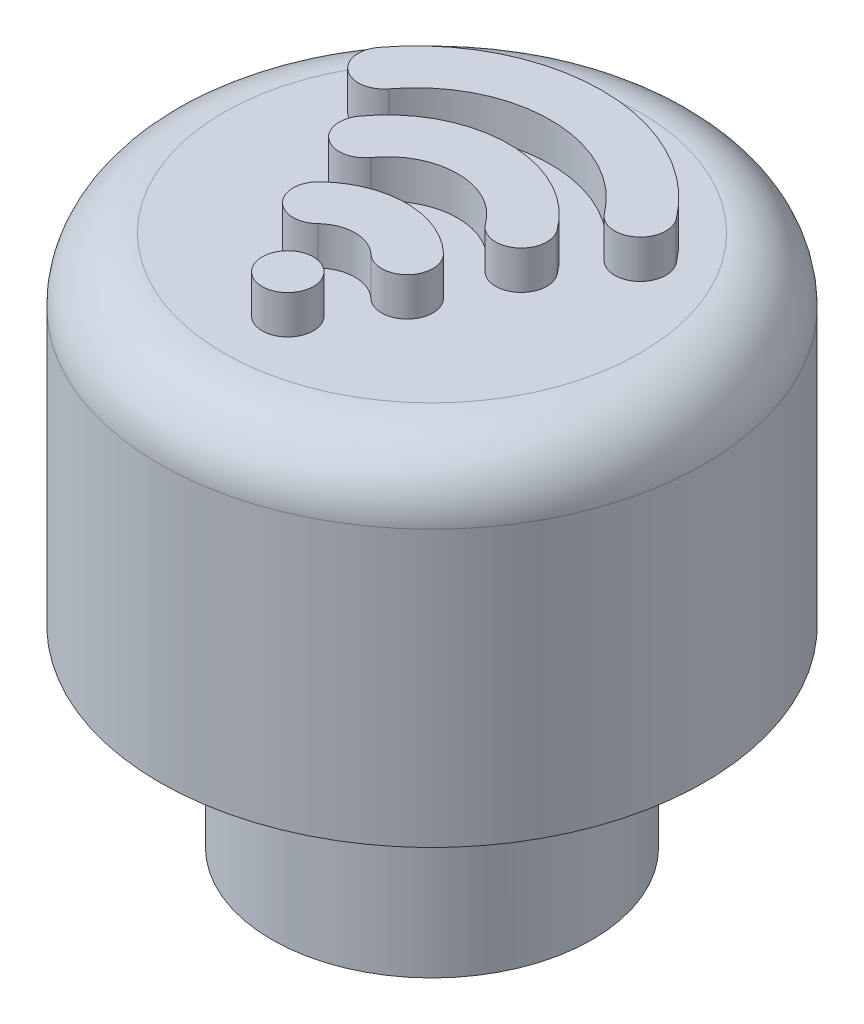
ISO-10303-21;
HEADER;
FILE_DESCRIPTION(('STEP AP214'),'2;1');
FILE_NAME('part.step','',(''),(''),'','','');
FILE_SCHEMA(('AUTOMOTIVE_DESIGN { 1 0 10303 214 1 1 1 1 }'));
ENDSEC;
DATA;
#1=APPLICATION_CONTEXT('core data for automotive mechanical design processes');
#2=APPLICATION_PROTOCOL_DEFINITION('international standard','automotive_design',2000,#1);
#3=PRODUCT_CONTEXT('',#1,'mechanical');
#4=PRODUCT('Part','Part','',(#3));
#5=PRODUCT_RELATED_PRODUCT_CATEGORY('part','',(#4));
#6=PRODUCT_DEFINITION_FORMATION('','',#4);
#7=PRODUCT_DEFINITION_CONTEXT('part definition',#1,'design');
#8=PRODUCT_DEFINITION('design','',#6,#7);
#9=PRODUCT_DEFINITION_SHAPE('','',#8);
#10=(LENGTH_UNIT() NAMED_UNIT(*) SI_UNIT(.MILLI.,.METRE.));
#11=(NAMED_UNIT(*) PLANE_ANGLE_UNIT() SI_UNIT($,.RADIAN.));
#12=(NAMED_UNIT(*) SI_UNIT($,.STERADIAN.) SOLID_ANGLE_UNIT());
#13=UNCERTAINTY_MEASURE_WITH_UNIT(LENGTH_MEASURE(1.E-05),#10,'distance_accuracy_value','');
#14=(GEOMETRIC_REPRESENTATION_CONTEXT(3) GLOBAL_UNCERTAINTY_ASSIGNED_CONTEXT((#13)) GLOBAL_UNIT_ASSIGNED_CONTEXT((#10,
#11,#12)) REPRESENTATION_CONTEXT('',''));
#15=CARTESIAN_POINT('',(0.,0.,0.));
#16=DIRECTION('',(0.,0.,1.));
#17=DIRECTION('',(1.,0.,0.));
#18=AXIS2_PLACEMENT_3D('',#15,#16,#17);
#19=CARTESIAN_POINT('',(0.,5.3,0.));
#20=DIRECTION('',(0.,1.,0.));
#21=DIRECTION('',(0.,0.,1.));
#22=AXIS2_PLACEMENT_3D('',#19,#20,#21);
#23=PLANE('',#22);
#24=CARTESIAN_POINT('',(0.,5.3,2.25));
#25=DIRECTION('',(0.,1.,0.));
#26=DIRECTION('',(0.,0.,1.));
#27=AXIS2_PLACEMENT_3D('',#24,#25,#26);
#28=CIRCLE('',#27,0.4);
#29=CARTESIAN_POINT('',(0.,5.3,2.65));
#30=VERTEX_POINT('',#29);
#31=EDGE_CURVE('E348',#30,#30,#28,.T.);
#32=ORIENTED_EDGE('',*,*,#31,.F.);
#33=EDGE_LOOP('',(#32));
#34=FACE_BOUND('',#33,.T.);
#35=CARTESIAN_POINT('',(0.,5.3,0.));
#36=DIRECTION('',(0.,1.,0.));
#37=DIRECTION('',(0.,0.,1.));
#38=AXIS2_PLACEMENT_3D('',#35,#36,#37);
#39=CIRCLE('',#38,3.25);
#40=CARTESIAN_POINT('',(0.,5.3,3.25));
#41=VERTEX_POINT('',#40);
#42=EDGE_CURVE('E45',#41,#41,#39,.T.);
#43=ORIENTED_EDGE('',*,*,#42,.T.);
#44=EDGE_LOOP('',(#43));
#45=FACE_BOUND('',#44,.T.);
#46=CARTESIAN_POINT('',(0.,5.3,1.8));
#47=DIRECTION('',(0.,1.,0.));
#48=DIRECTION('',(0.,0.,1.));
#49=AXIS2_PLACEMENT_3D('',#46,#47,#48);
#50=CIRCLE('',#49,1.4);
#51=CARTESIAN_POINT('',(0.966334518519157,5.3,0.786985884442695));
#52=VERTEX_POINT('',#51);
#53=CARTESIAN_POINT('',(-0.966334518519156,5.3,0.786985884442695));
#54=VERTEX_POINT('',#53);
#55=EDGE_CURVE('E197',#52,#54,#50,.T.);
#56=ORIENTED_EDGE('',*,*,#55,.F.);
#57=CARTESIAN_POINT('',(0.690238941799398,5.3,1.07641848888764));
#58=DIRECTION('',(0.,1.,0.));
#59=DIRECTION('',(0.,0.,1.));
#60=AXIS2_PLACEMENT_3D('',#57,#58,#59);
#61=CIRCLE('',#60,0.4);
#62=CARTESIAN_POINT('',(0.414143365079639,5.3,1.36585109333258));
#63=VERTEX_POINT('',#62);
#64=EDGE_CURVE('E183',#63,#52,#61,.T.);
#65=ORIENTED_EDGE('',*,*,#64,.F.);
#66=CARTESIAN_POINT('',(0.,5.3,1.8));
#67=DIRECTION('',(0.,-1.,0.));
#68=DIRECTION('',(0.,0.,1.));
#69=AXIS2_PLACEMENT_3D('',#66,#67,#68);
#70=CIRCLE('',#69,0.6);
#71=CARTESIAN_POINT('',(-0.414143365079638,5.3,1.36585109333258));
#72=VERTEX_POINT('',#71);
#73=EDGE_CURVE('E188',#72,#63,#70,.T.);
#74=ORIENTED_EDGE('',*,*,#73,.F.);
#75=CARTESIAN_POINT('',(-0.690238941799397,5.3,1.07641848888764));
#76=DIRECTION('',(0.,1.,0.));
#77=DIRECTION('',(0.,0.,1.));
#78=AXIS2_PLACEMENT_3D('',#75,#76,#77);
#79=CIRCLE('',#78,0.4);
#80=EDGE_CURVE('E199',#54,#72,#79,.T.);
#81=ORIENTED_EDGE('',*,*,#80,.F.);
#82=EDGE_LOOP('',(#56,#65,#74,#81));
#83=FACE_BOUND('',#82,.T.);
#84=CARTESIAN_POINT('',(0.,5.3,0.700000000000003));
#85=DIRECTION('',(0.,1.,0.));
#86=DIRECTION('',(0.,0.,1.));
#87=AXIS2_PLACEMENT_3D('',#84,#85,#86);
#88=CIRCLE('',#87,1.9);
#89=CARTESIAN_POINT('',(1.54505647776401,5.3,-0.405803093014059));
#90=VERTEX_POINT('',#89);
#91=CARTESIAN_POINT('',(-1.54505647776401,5.3,-0.405803093014059));
#92=VERTEX_POINT('',#91);
#93=EDGE_CURVE('E155',#90,#92,#88,.T.);
#94=ORIENTED_EDGE('',*,*,#93,.F.);
#95=CARTESIAN_POINT('',(1.21978142981369,5.3,-0.173002441853206));
#96=DIRECTION('',(0.,1.,0.));
#97=DIRECTION('',(0.,0.,1.));
#98=AXIS2_PLACEMENT_3D('',#95,#96,#97);
#99=CIRCLE('',#98,0.399999999999999);
#100=CARTESIAN_POINT('',(0.894506381863375,5.3,0.0597982093076501));
#101=VERTEX_POINT('',#100);
#102=EDGE_CURVE('E152',#101,#90,#99,.T.);
#103=ORIENTED_EDGE('',*,*,#102,.F.);
#104=CARTESIAN_POINT('',(0.,5.3,0.700000000000003));
#105=DIRECTION('',(0.,-1.,0.));
#106=DIRECTION('',(0.,0.,1.));
#107=AXIS2_PLACEMENT_3D('',#104,#105,#106);
#108=CIRCLE('',#107,1.1);
#109=CARTESIAN_POINT('',(-0.894506381863376,5.3,0.0597982093076501));
#110=VERTEX_POINT('',#109);
#111=EDGE_CURVE('E164',#110,#101,#108,.T.);
#112=ORIENTED_EDGE('',*,*,#111,.F.);
#113=CARTESIAN_POINT('',(-1.2197814298137,5.3,-0.173002441853206));
#114=DIRECTION('',(0.,1.,0.));
#115=DIRECTION('',(0.,0.,1.));
#116=AXIS2_PLACEMENT_3D('',#113,#114,#115);
#117=CIRCLE('',#116,0.399999999999999);
#118=EDGE_CURVE('E172',#92,#110,#117,.T.);
#119=ORIENTED_EDGE('',*,*,#118,.F.);
#120=EDGE_LOOP('',(#94,#103,#112,#119));
#121=FACE_BOUND('',#120,.T.);
#122=CARTESIAN_POINT('',(0.,5.3,0.250000000000002));
#123=DIRECTION('',(0.,1.,0.));
#124=DIRECTION('',(0.,0.,1.));
#125=AXIS2_PLACEMENT_3D('',#122,#123,#124);
#126=CIRCLE('',#125,2.9);
#127=CARTESIAN_POINT('',(2.32,5.3,-1.49));
#128=VERTEX_POINT('',#127);
#129=CARTESIAN_POINT('',(-2.32,5.3,-1.49));
#130=VERTEX_POINT('',#129);
#131=EDGE_CURVE('E350',#128,#130,#126,.T.);
#132=ORIENTED_EDGE('',*,*,#131,.F.);
#133=CARTESIAN_POINT('',(2.,5.3,-1.25));
#134=DIRECTION('',(0.,1.,0.));
#135=DIRECTION('',(0.,0.,1.));
#136=AXIS2_PLACEMENT_3D('',#133,#134,#135);
#137=CIRCLE('',#136,0.4);
#138=CARTESIAN_POINT('',(1.68,5.3,-1.01));
#139=VERTEX_POINT('',#138);
#140=EDGE_CURVE('E150',#139,#128,#137,.T.);
#141=ORIENTED_EDGE('',*,*,#140,.F.);
#142=CARTESIAN_POINT('',(0.,5.3,0.250000000000002));
#143=DIRECTION('',(0.,-1.,0.));
#144=DIRECTION('',(0.,0.,1.));
#145=AXIS2_PLACEMENT_3D('',#142,#143,#144);
#146=CIRCLE('',#145,2.1);
#147=CARTESIAN_POINT('',(-1.68,5.3,-1.01));
#148=VERTEX_POINT('',#147);
#149=EDGE_CURVE('E146',#148,#139,#146,.T.);
#150=ORIENTED_EDGE('',*,*,#149,.F.);
#151=CARTESIAN_POINT('',(-2.,5.3,-1.25));
#152=DIRECTION('',(0.,1.,0.));
#153=DIRECTION('',(0.,0.,1.));
#154=AXIS2_PLACEMENT_3D('',#151,#152,#153);
#155=CIRCLE('',#154,0.4);
#156=EDGE_CURVE('E359',#130,#148,#155,.T.);
#157=ORIENTED_EDGE('',*,*,#156,.F.);
#158=EDGE_LOOP('',(#132,#141,#150,#157));
#159=FACE_BOUND('',#158,.T.);
#160=ADVANCED_FACE('F37',(#34,#45,#83,#121,#159),#23,.T.);
#161=CARTESIAN_POINT('',(0.,4.3,0.));
#162=DIRECTION('',(0.,1.,0.));
#163=DIRECTION('',(0.,0.,1.));
#164=AXIS2_PLACEMENT_3D('',#161,#162,#163);
#165=TOROIDAL_SURFACE('',#164,3.25,1.);
#166=ORIENTED_EDGE('',*,*,#42,.F.);
#167=EDGE_LOOP('',(#166));
#168=FACE_BOUND('',#167,.T.);
#169=CARTESIAN_POINT('',(0.,4.3,0.));
#170=DIRECTION('',(0.,1.,0.));
#171=DIRECTION('',(0.,0.,1.));
#172=AXIS2_PLACEMENT_3D('',#169,#170,#171);
#173=CIRCLE('',#172,4.25);
#174=CARTESIAN_POINT('',(0.,4.3,4.25));
#175=VERTEX_POINT('',#174);
#176=EDGE_CURVE('E11',#175,#175,#173,.F.);
#177=ORIENTED_EDGE('',*,*,#176,.F.);
#178=EDGE_LOOP('',(#177));
#179=FACE_BOUND('',#178,.T.);
#180=ADVANCED_FACE('F39',(#168,#179),#165,.T.);
#181=CARTESIAN_POINT('',(0.,5.3,0.));
#182=DIRECTION('',(0.,-1.,0.));
#183=DIRECTION('',(0.,0.,-1.));
#184=AXIS2_PLACEMENT_3D('',#181,#182,#183);
#185=CYLINDRICAL_SURFACE('',#184,4.25);
#186=ORIENTED_EDGE('',*,*,#176,.T.);
#187=EDGE_LOOP('',(#186));
#188=FACE_BOUND('',#187,.T.);
#189=CARTESIAN_POINT('',(0.,0.,0.));
#190=DIRECTION('',(0.,1.,0.));
#191=DIRECTION('',(0.,0.,1.));
#192=AXIS2_PLACEMENT_3D('',#189,#190,#191);
#193=CIRCLE('',#192,4.25);
#194=CARTESIAN_POINT('',(0.,0.,4.25));
#195=VERTEX_POINT('',#194);
#196=EDGE_CURVE('E227',#195,#195,#193,.T.);
#197=ORIENTED_EDGE('',*,*,#196,.T.);
#198=EDGE_LOOP('',(#197));
#199=FACE_BOUND('',#198,.T.);
#200=ADVANCED_FACE('F239',(#188,#199),#185,.T.);
#201=CARTESIAN_POINT('',(0.,0.,0.));
#202=DIRECTION('',(0.,1.,0.));
#203=DIRECTION('',(0.,0.,1.));
#204=AXIS2_PLACEMENT_3D('',#201,#202,#203);
#205=PLANE('',#204);
#206=CARTESIAN_POINT('',(0.,0.,0.));
#207=DIRECTION('',(0.,1.,0.));
#208=DIRECTION('',(0.,0.,1.));
#209=AXIS2_PLACEMENT_3D('',#206,#207,#208);
#210=CIRCLE('',#209,2.5);
#211=CARTESIAN_POINT('',(0.,0.,2.5));
#212=VERTEX_POINT('',#211);
#213=EDGE_CURVE('E230',#212,#212,#210,.F.);
#214=ORIENTED_EDGE('',*,*,#213,.F.);
#215=EDGE_LOOP('',(#214));
#216=FACE_BOUND('',#215,.T.);
#217=ORIENTED_EDGE('',*,*,#196,.F.);
#218=EDGE_LOOP('',(#217));
#219=FACE_BOUND('',#218,.T.);
#220=ADVANCED_FACE('F244',(#216,#219),#205,.F.);
#221=CARTESIAN_POINT('',(0.,-3.,0.));
#222=DIRECTION('',(0.,1.,0.));
#223=DIRECTION('',(0.,0.,1.));
#224=AXIS2_PLACEMENT_3D('',#221,#222,#223);
#225=CYLINDRICAL_SURFACE('',#224,2.5);
#226=CARTESIAN_POINT('',(0.,-3.,0.));
#227=DIRECTION('',(0.,-1.,0.));
#228=DIRECTION('',(0.,0.,-1.));
#229=AXIS2_PLACEMENT_3D('',#226,#227,#228);
#230=CIRCLE('',#229,2.5);
#231=CARTESIAN_POINT('',(0.,-3.,-2.5));
#232=VERTEX_POINT('',#231);
#233=EDGE_CURVE('E222',#232,#232,#230,.T.);
#234=ORIENTED_EDGE('',*,*,#233,.F.);
#235=EDGE_LOOP('',(#234));
#236=FACE_BOUND('',#235,.T.);
#237=ORIENTED_EDGE('',*,*,#213,.T.);
#238=EDGE_LOOP('',(#237));
#239=FACE_BOUND('',#238,.T.);
#240=ADVANCED_FACE('F248',(#236,#239),#225,.T.);
#241=CARTESIAN_POINT('',(0.,-3.,0.));
#242=DIRECTION('',(0.,-1.,0.));
#243=DIRECTION('',(0.,0.,-1.));
#244=AXIS2_PLACEMENT_3D('',#241,#242,#243);
#245=PLANE('',#244);
#246=CARTESIAN_POINT('',(0.,-3.,0.));
#247=DIRECTION('',(0.,-1.,0.));
#248=DIRECTION('',(0.,0.,-1.));
#249=AXIS2_PLACEMENT_3D('',#246,#247,#248);
#250=CIRCLE('',#249,1.8);
#251=CARTESIAN_POINT('',(0.,-3.,-1.8));
#252=VERTEX_POINT('',#251);
#253=EDGE_CURVE('E212',#252,#252,#250,.T.);
#254=ORIENTED_EDGE('',*,*,#253,.F.);
#255=EDGE_LOOP('',(#254));
#256=FACE_BOUND('',#255,.T.);
#257=ORIENTED_EDGE('',*,*,#233,.T.);
#258=EDGE_LOOP('',(#257));
#259=FACE_BOUND('',#258,.T.);
#260=ADVANCED_FACE('F254',(#256,#259),#245,.T.);
#261=CARTESIAN_POINT('',(0.,5.3,0.));
#262=DIRECTION('',(0.,-1.,0.));
#263=DIRECTION('',(0.,0.,-1.));
#264=AXIS2_PLACEMENT_3D('',#261,#262,#263);
#265=CYLINDRICAL_SURFACE('',#264,3.55);
#266=CARTESIAN_POINT('',(0.,4.6,0.));
#267=DIRECTION('',(0.,1.,0.));
#268=DIRECTION('',(0.,0.,1.));
#269=AXIS2_PLACEMENT_3D('',#266,#267,#268);
#270=CIRCLE('',#269,3.55);
#271=CARTESIAN_POINT('',(0.,4.6,3.55));
#272=VERTEX_POINT('',#271);
#273=EDGE_CURVE('E213',#272,#272,#270,.T.);
#274=ORIENTED_EDGE('',*,*,#273,.T.);
#275=EDGE_LOOP('',(#274));
#276=FACE_BOUND('',#275,.T.);
#277=CARTESIAN_POINT('',(0.,0.7,0.));
#278=DIRECTION('',(0.,1.,0.));
#279=DIRECTION('',(0.,0.,1.));
#280=AXIS2_PLACEMENT_3D('',#277,#278,#279);
#281=CIRCLE('',#280,3.55);
#282=CARTESIAN_POINT('',(0.,0.7,3.55));
#283=VERTEX_POINT('',#282);
#284=EDGE_CURVE('E217',#283,#283,#281,.T.);
#285=ORIENTED_EDGE('',*,*,#284,.F.);
#286=EDGE_LOOP('',(#285));
#287=FACE_BOUND('',#286,.T.);
#288=ADVANCED_FACE('F267',(#276,#287),#265,.F.);
#289=CARTESIAN_POINT('',(0.,4.6,0.));
#290=DIRECTION('',(0.,1.,0.));
#291=DIRECTION('',(0.,0.,1.));
#292=AXIS2_PLACEMENT_3D('',#289,#290,#291);
#293=PLANE('',#292);
#294=ORIENTED_EDGE('',*,*,#273,.F.);
#295=EDGE_LOOP('',(#294));
#296=FACE_BOUND('',#295,.T.);
#297=ADVANCED_FACE('F277',(#296),#293,.F.);
#298=CARTESIAN_POINT('',(0.,0.7,0.));
#299=DIRECTION('',(0.,1.,0.));
#300=DIRECTION('',(0.,0.,1.));
#301=AXIS2_PLACEMENT_3D('',#298,#299,#300);
#302=PLANE('',#301);
#303=CARTESIAN_POINT('',(0.,0.7,0.));
#304=DIRECTION('',(0.,1.,0.));
#305=DIRECTION('',(0.,0.,1.));
#306=AXIS2_PLACEMENT_3D('',#303,#304,#305);
#307=CIRCLE('',#306,1.8);
#308=CARTESIAN_POINT('',(0.,0.7,1.8));
#309=VERTEX_POINT('',#308);
#310=EDGE_CURVE('E216',#309,#309,#307,.F.);
#311=ORIENTED_EDGE('',*,*,#310,.T.);
#312=EDGE_LOOP('',(#311));
#313=FACE_BOUND('',#312,.T.);
#314=ORIENTED_EDGE('',*,*,#284,.T.);
#315=EDGE_LOOP('',(#314));
#316=FACE_BOUND('',#315,.T.);
#317=ADVANCED_FACE('F273',(#313,#316),#302,.T.);
#318=CARTESIAN_POINT('',(0.,-3.,0.));
#319=DIRECTION('',(0.,1.,0.));
#320=DIRECTION('',(0.,0.,1.));
#321=AXIS2_PLACEMENT_3D('',#318,#319,#320);
#322=CYLINDRICAL_SURFACE('',#321,1.8);
#323=ORIENTED_EDGE('',*,*,#253,.T.);
#324=EDGE_LOOP('',(#323));
#325=FACE_BOUND('',#324,.T.);
#326=ORIENTED_EDGE('',*,*,#310,.F.);
#327=EDGE_LOOP('',(#326));
#328=FACE_BOUND('',#327,.T.);
#329=ADVANCED_FACE('F269',(#325,#328),#322,.F.);
#330=CARTESIAN_POINT('',(0.690238941799398,5.9,1.07641848888764));
#331=DIRECTION('',(0.,-1.,0.));
#332=DIRECTION('',(0.,0.,-1.));
#333=AXIS2_PLACEMENT_3D('',#330,#331,#332);
#334=CYLINDRICAL_SURFACE('',#333,0.4);
#335=ORIENTED_EDGE('',*,*,#64,.T.);
#336=DIRECTION('',(0.,-1.,0.));
#337=VECTOR('',#336,1.);
#338=CARTESIAN_POINT('',(0.966334518519157,5.9,0.786985884442695));
#339=LINE('',#338,#337);
#340=CARTESIAN_POINT('',(0.966334518519157,5.9,0.786985884442695));
#341=VERTEX_POINT('',#340);
#342=EDGE_CURVE('E210',#341,#52,#339,.T.);
#343=ORIENTED_EDGE('',*,*,#342,.F.);
#344=CARTESIAN_POINT('',(0.690238941799398,5.9,1.07641848888764));
#345=DIRECTION('',(0.,1.,0.));
#346=DIRECTION('',(0.,0.,1.));
#347=AXIS2_PLACEMENT_3D('',#344,#345,#346);
#348=CIRCLE('',#347,0.4);
#349=CARTESIAN_POINT('',(0.414143365079639,5.9,1.36585109333258));
#350=VERTEX_POINT('',#349);
#351=EDGE_CURVE('E184',#350,#341,#348,.T.);
#352=ORIENTED_EDGE('',*,*,#351,.F.);
#353=DIRECTION('',(0.,-1.,0.));
#354=VECTOR('',#353,1.);
#355=CARTESIAN_POINT('',(0.414143365079639,5.9,1.36585109333258));
#356=LINE('',#355,#354);
#357=EDGE_CURVE('E194',#350,#63,#356,.T.);
#358=ORIENTED_EDGE('',*,*,#357,.T.);
#359=EDGE_LOOP('',(#335,#343,#352,#358));
#360=FACE_BOUND('',#359,.T.);
#361=ADVANCED_FACE('F272',(#360),#334,.T.);
#362=CARTESIAN_POINT('',(0.,5.9,1.8));
#363=DIRECTION('',(0.,-1.,0.));
#364=DIRECTION('',(0.,0.,-1.));
#365=AXIS2_PLACEMENT_3D('',#362,#363,#364);
#366=CYLINDRICAL_SURFACE('',#365,1.4);
#367=ORIENTED_EDGE('',*,*,#55,.T.);
#368=DIRECTION('',(0.,-1.,0.));
#369=VECTOR('',#368,1.);
#370=CARTESIAN_POINT('',(-0.966334518519156,5.9,0.786985884442695));
#371=LINE('',#370,#369);
#372=CARTESIAN_POINT('',(-0.966334518519156,5.9,0.786985884442695));
#373=VERTEX_POINT('',#372);
#374=EDGE_CURVE('E207',#373,#54,#371,.T.);
#375=ORIENTED_EDGE('',*,*,#374,.F.);
#376=CARTESIAN_POINT('',(0.,5.9,1.8));
#377=DIRECTION('',(0.,1.,0.));
#378=DIRECTION('',(0.,0.,1.));
#379=AXIS2_PLACEMENT_3D('',#376,#377,#378);
#380=CIRCLE('',#379,1.4);
#381=EDGE_CURVE('E187',#341,#373,#380,.T.);
#382=ORIENTED_EDGE('',*,*,#381,.F.);
#383=ORIENTED_EDGE('',*,*,#342,.T.);
#384=EDGE_LOOP('',(#367,#375,#382,#383));
#385=FACE_BOUND('',#384,.T.);
#386=ADVANCED_FACE('F287',(#385),#366,.T.);
#387=CARTESIAN_POINT('',(-0.690238941799397,5.9,1.07641848888764));
#388=DIRECTION('',(0.,-1.,0.));
#389=DIRECTION('',(0.,0.,-1.));
#390=AXIS2_PLACEMENT_3D('',#387,#388,#389);
#391=CYLINDRICAL_SURFACE('',#390,0.4);
#392=ORIENTED_EDGE('',*,*,#80,.T.);
#393=DIRECTION('',(0.,-1.,0.));
#394=VECTOR('',#393,1.);
#395=CARTESIAN_POINT('',(-0.414143365079638,5.9,1.36585109333258));
#396=LINE('',#395,#394);
#397=CARTESIAN_POINT('',(-0.414143365079638,5.9,1.36585109333258));
#398=VERTEX_POINT('',#397);
#399=EDGE_CURVE('E205',#398,#72,#396,.T.);
#400=ORIENTED_EDGE('',*,*,#399,.F.);
#401=CARTESIAN_POINT('',(-0.690238941799397,5.9,1.07641848888764));
#402=DIRECTION('',(0.,1.,0.));
#403=DIRECTION('',(0.,0.,1.));
#404=AXIS2_PLACEMENT_3D('',#401,#402,#403);
#405=CIRCLE('',#404,0.4);
#406=EDGE_CURVE('E190',#373,#398,#405,.T.);
#407=ORIENTED_EDGE('',*,*,#406,.F.);
#408=ORIENTED_EDGE('',*,*,#374,.T.);
#409=EDGE_LOOP('',(#392,#400,#407,#408));
#410=FACE_BOUND('',#409,.T.);
#411=ADVANCED_FACE('F291',(#410),#391,.T.);
#412=CARTESIAN_POINT('',(0.,5.9,1.8));
#413=DIRECTION('',(0.,-1.,0.));
#414=DIRECTION('',(0.,0.,-1.));
#415=AXIS2_PLACEMENT_3D('',#412,#413,#414);
#416=CYLINDRICAL_SURFACE('',#415,0.6);
#417=ORIENTED_EDGE('',*,*,#73,.T.);
#418=ORIENTED_EDGE('',*,*,#357,.F.);
#419=CARTESIAN_POINT('',(0.,5.9,1.8));
#420=DIRECTION('',(0.,-1.,0.));
#421=DIRECTION('',(0.,0.,1.));
#422=AXIS2_PLACEMENT_3D('',#419,#420,#421);
#423=CIRCLE('',#422,0.6);
#424=EDGE_CURVE('E192',#398,#350,#423,.T.);
#425=ORIENTED_EDGE('',*,*,#424,.F.);
#426=ORIENTED_EDGE('',*,*,#399,.T.);
#427=EDGE_LOOP('',(#417,#418,#425,#426));
#428=FACE_BOUND('',#427,.T.);
#429=ADVANCED_FACE('F295',(#428),#416,.F.);
#430=CARTESIAN_POINT('',(0.345119470899699,5.9,1.43820924444382));
#431=DIRECTION('',(0.,1.,0.));
#432=DIRECTION('',(0.,0.,1.));
#433=AXIS2_PLACEMENT_3D('',#430,#431,#432);
#434=PLANE('',#433);
#435=ORIENTED_EDGE('',*,*,#351,.T.);
#436=ORIENTED_EDGE('',*,*,#381,.T.);
#437=ORIENTED_EDGE('',*,*,#406,.T.);
#438=ORIENTED_EDGE('',*,*,#424,.T.);
#439=EDGE_LOOP('',(#435,#436,#437,#438));
#440=FACE_BOUND('',#439,.T.);
#441=ADVANCED_FACE('F299',(#440),#434,.T.);
#442=CARTESIAN_POINT('',(1.21978142981369,5.9,-0.173002441853206));
#443=DIRECTION('',(0.,-1.,0.));
#444=DIRECTION('',(0.,0.,-1.));
#445=AXIS2_PLACEMENT_3D('',#442,#443,#444);
#446=CYLINDRICAL_SURFACE('',#445,0.399999999999999);
#447=ORIENTED_EDGE('',*,*,#102,.T.);
#448=DIRECTION('',(0.,-1.,0.));
#449=VECTOR('',#448,1.);
#450=CARTESIAN_POINT('',(1.54505647776401,5.9,-0.405803093014059));
#451=LINE('',#450,#449);
#452=CARTESIAN_POINT('',(1.54505647776401,5.9,-0.405803093014059));
#453=VERTEX_POINT('',#452);
#454=EDGE_CURVE('E181',#453,#90,#451,.T.);
#455=ORIENTED_EDGE('',*,*,#454,.F.);
#456=CARTESIAN_POINT('',(1.21978142981369,5.9,-0.173002441853206));
#457=DIRECTION('',(0.,1.,0.));
#458=DIRECTION('',(0.,0.,1.));
#459=AXIS2_PLACEMENT_3D('',#456,#457,#458);
#460=CIRCLE('',#459,0.399999999999999);
#461=CARTESIAN_POINT('',(0.894506381863375,5.9,0.0597982093076501));
#462=VERTEX_POINT('',#461);
#463=EDGE_CURVE('E160',#462,#453,#460,.T.);
#464=ORIENTED_EDGE('',*,*,#463,.F.);
#465=DIRECTION('',(0.,-1.,0.));
#466=VECTOR('',#465,1.);
#467=CARTESIAN_POINT('',(0.894506381863375,5.9,0.0597982093076501));
#468=LINE('',#467,#466);
#469=EDGE_CURVE('E169',#462,#101,#468,.T.);
#470=ORIENTED_EDGE('',*,*,#469,.T.);
#471=EDGE_LOOP('',(#447,#455,#464,#470));
#472=FACE_BOUND('',#471,.T.);
#473=ADVANCED_FACE('F303',(#472),#446,.T.);
#474=CARTESIAN_POINT('',(0.,5.9,0.700000000000003));
#475=DIRECTION('',(0.,-1.,0.));
#476=DIRECTION('',(0.,0.,-1.));
#477=AXIS2_PLACEMENT_3D('',#474,#475,#476);
#478=CYLINDRICAL_SURFACE('',#477,1.9);
#479=ORIENTED_EDGE('',*,*,#93,.T.);
#480=DIRECTION('',(0.,-1.,0.));
#481=VECTOR('',#480,1.);
#482=CARTESIAN_POINT('',(-1.54505647776401,5.9,-0.405803093014059));
#483=LINE('',#482,#481);
#484=CARTESIAN_POINT('',(-1.54505647776401,5.9,-0.405803093014059));
#485=VERTEX_POINT('',#484);
#486=EDGE_CURVE('E178',#485,#92,#483,.T.);
#487=ORIENTED_EDGE('',*,*,#486,.F.);
#488=CARTESIAN_POINT('',(0.,5.9,0.700000000000003));
#489=DIRECTION('',(0.,1.,0.));
#490=DIRECTION('',(0.,0.,1.));
#491=AXIS2_PLACEMENT_3D('',#488,#489,#490);
#492=CIRCLE('',#491,1.9);
#493=EDGE_CURVE('E163',#453,#485,#492,.T.);
#494=ORIENTED_EDGE('',*,*,#493,.F.);
#495=ORIENTED_EDGE('',*,*,#454,.T.);
#496=EDGE_LOOP('',(#479,#487,#494,#495));
#497=FACE_BOUND('',#496,.T.);
#498=ADVANCED_FACE('F307',(#497),#478,.T.);
#499=CARTESIAN_POINT('',(-1.2197814298137,5.9,-0.173002441853206));
#500=DIRECTION('',(0.,-1.,0.));
#501=DIRECTION('',(0.,0.,-1.));
#502=AXIS2_PLACEMENT_3D('',#499,#500,#501);
#503=CYLINDRICAL_SURFACE('',#502,0.399999999999999);
#504=ORIENTED_EDGE('',*,*,#118,.T.);
#505=DIRECTION('',(0.,-1.,0.));
#506=VECTOR('',#505,1.);
#507=CARTESIAN_POINT('',(-0.894506381863378,5.9,0.0597982093076484));
#508=LINE('',#507,#506);
#509=CARTESIAN_POINT('',(-0.894506381863378,5.9,0.0597982093076484));
#510=VERTEX_POINT('',#509);
#511=EDGE_CURVE('E60',#510,#110,#508,.T.);
#512=ORIENTED_EDGE('',*,*,#511,.F.);
#513=CARTESIAN_POINT('',(-1.2197814298137,5.9,-0.173002441853206));
#514=DIRECTION('',(0.,1.,0.));
#515=DIRECTION('',(0.,0.,1.));
#516=AXIS2_PLACEMENT_3D('',#513,#514,#515);
#517=CIRCLE('',#516,0.399999999999999);
#518=EDGE_CURVE('E166',#485,#510,#517,.T.);
#519=ORIENTED_EDGE('',*,*,#518,.F.);
#520=ORIENTED_EDGE('',*,*,#486,.T.);
#521=EDGE_LOOP('',(#504,#512,#519,#520));
#522=FACE_BOUND('',#521,.T.);
#523=ADVANCED_FACE('F311',(#522),#503,.T.);
#524=CARTESIAN_POINT('',(0.,5.9,0.700000000000003));
#525=DIRECTION('',(0.,-1.,0.));
#526=DIRECTION('',(0.,0.,-1.));
#527=AXIS2_PLACEMENT_3D('',#524,#525,#526);
#528=CYLINDRICAL_SURFACE('',#527,1.1);
#529=ORIENTED_EDGE('',*,*,#111,.T.);
#530=ORIENTED_EDGE('',*,*,#469,.F.);
#531=CARTESIAN_POINT('',(0.,5.9,0.700000000000003));
#532=DIRECTION('',(0.,-1.,0.));
#533=DIRECTION('',(0.,0.,1.));
#534=AXIS2_PLACEMENT_3D('',#531,#532,#533);
#535=CIRCLE('',#534,1.1);
#536=EDGE_CURVE('E168',#510,#462,#535,.T.);
#537=ORIENTED_EDGE('',*,*,#536,.F.);
#538=ORIENTED_EDGE('',*,*,#511,.T.);
#539=EDGE_LOOP('',(#529,#530,#537,#538));
#540=FACE_BOUND('',#539,.T.);
#541=ADVANCED_FACE('F315',(#540),#528,.F.);
#542=CARTESIAN_POINT('',(0.609890714906847,5.9,0.263498779073398));
#543=DIRECTION('',(0.,1.,0.));
#544=DIRECTION('',(0.,0.,1.));
#545=AXIS2_PLACEMENT_3D('',#542,#543,#544);
#546=PLANE('',#545);
#547=ORIENTED_EDGE('',*,*,#463,.T.);
#548=ORIENTED_EDGE('',*,*,#493,.T.);
#549=ORIENTED_EDGE('',*,*,#518,.T.);
#550=ORIENTED_EDGE('',*,*,#536,.T.);
#551=EDGE_LOOP('',(#547,#548,#549,#550));
#552=FACE_BOUND('',#551,.T.);
#553=ADVANCED_FACE('F319',(#552),#546,.T.);
#554=CARTESIAN_POINT('',(2.,5.9,-1.25));
#555=DIRECTION('',(0.,-1.,0.));
#556=DIRECTION('',(0.,0.,-1.));
#557=AXIS2_PLACEMENT_3D('',#554,#555,#556);
#558=CYLINDRICAL_SURFACE('',#557,0.4);
#559=ORIENTED_EDGE('',*,*,#140,.T.);
#560=DIRECTION('',(0.,-1.,0.));
#561=VECTOR('',#560,1.);
#562=CARTESIAN_POINT('',(2.32,5.9,-1.49));
#563=LINE('',#562,#561);
#564=CARTESIAN_POINT('',(2.32,5.9,-1.49));
#565=VERTEX_POINT('',#564);
#566=EDGE_CURVE('E131',#565,#128,#563,.T.);
#567=ORIENTED_EDGE('',*,*,#566,.F.);
#568=CARTESIAN_POINT('',(2.,5.9,-1.25));
#569=DIRECTION('',(0.,1.,0.));
#570=DIRECTION('',(0.,0.,1.));
#571=AXIS2_PLACEMENT_3D('',#568,#569,#570);
#572=CIRCLE('',#571,0.4);
#573=CARTESIAN_POINT('',(1.68,5.9,-1.01));
#574=VERTEX_POINT('',#573);
#575=EDGE_CURVE('E138',#574,#565,#572,.T.);
#576=ORIENTED_EDGE('',*,*,#575,.F.);
#577=DIRECTION('',(0.,-1.,0.));
#578=VECTOR('',#577,1.);
#579=CARTESIAN_POINT('',(1.68,5.9,-1.01));
#580=LINE('',#579,#578);
#581=EDGE_CURVE('E356',#574,#139,#580,.T.);
#582=ORIENTED_EDGE('',*,*,#581,.T.);
#583=EDGE_LOOP('',(#559,#567,#576,#582));
#584=FACE_BOUND('',#583,.T.);
#585=ADVANCED_FACE('F148',(#584),#558,.T.);
#586=CARTESIAN_POINT('',(0.,5.9,0.250000000000002));
#587=DIRECTION('',(0.,-1.,0.));
#588=DIRECTION('',(0.,0.,-1.));
#589=AXIS2_PLACEMENT_3D('',#586,#587,#588);
#590=CYLINDRICAL_SURFACE('',#589,2.9);
#591=ORIENTED_EDGE('',*,*,#131,.T.);
#592=DIRECTION('',(0.,-1.,0.));
#593=VECTOR('',#592,1.);
#594=CARTESIAN_POINT('',(-2.32,5.9,-1.49));
#595=LINE('',#594,#593);
#596=CARTESIAN_POINT('',(-2.32,5.9,-1.49));
#597=VERTEX_POINT('',#596);
#598=EDGE_CURVE('E134',#597,#130,#595,.T.);
#599=ORIENTED_EDGE('',*,*,#598,.F.);
#600=CARTESIAN_POINT('',(0.,5.9,0.250000000000002));
#601=DIRECTION('',(0.,1.,0.));
#602=DIRECTION('',(0.,0.,1.));
#603=AXIS2_PLACEMENT_3D('',#600,#601,#602);
#604=CIRCLE('',#603,2.9);
#605=EDGE_CURVE('E127',#565,#597,#604,.T.);
#606=ORIENTED_EDGE('',*,*,#605,.F.);
#607=ORIENTED_EDGE('',*,*,#566,.T.);
#608=EDGE_LOOP('',(#591,#599,#606,#607));
#609=FACE_BOUND('',#608,.T.);
#610=ADVANCED_FACE('F129',(#609),#590,.T.);
#611=CARTESIAN_POINT('',(-2.,5.9,-1.25));
#612=DIRECTION('',(0.,-1.,0.));
#613=DIRECTION('',(0.,0.,-1.));
#614=AXIS2_PLACEMENT_3D('',#611,#612,#613);
#615=CYLINDRICAL_SURFACE('',#614,0.4);
#616=ORIENTED_EDGE('',*,*,#156,.T.);
#617=DIRECTION('',(0.,-1.,0.));
#618=VECTOR('',#617,1.);
#619=CARTESIAN_POINT('',(-1.68,5.9,-1.01));
#620=LINE('',#619,#618);
#621=CARTESIAN_POINT('',(-1.68,5.9,-1.01));
#622=VERTEX_POINT('',#621);
#623=EDGE_CURVE('E52',#622,#148,#620,.T.);
#624=ORIENTED_EDGE('',*,*,#623,.F.);
#625=CARTESIAN_POINT('',(-2.,5.9,-1.25));
#626=DIRECTION('',(0.,1.,0.));
#627=DIRECTION('',(0.,0.,1.));
#628=AXIS2_PLACEMENT_3D('',#625,#626,#627);
#629=CIRCLE('',#628,0.4);
#630=EDGE_CURVE('E137',#597,#622,#629,.T.);
#631=ORIENTED_EDGE('',*,*,#630,.F.);
#632=ORIENTED_EDGE('',*,*,#598,.T.);
#633=EDGE_LOOP('',(#616,#624,#631,#632));
#634=FACE_BOUND('',#633,.T.);
#635=ADVANCED_FACE('F327',(#634),#615,.T.);
#636=CARTESIAN_POINT('',(0.,5.9,0.250000000000002));
#637=DIRECTION('',(0.,-1.,0.));
#638=DIRECTION('',(0.,0.,-1.));
#639=AXIS2_PLACEMENT_3D('',#636,#637,#638);
#640=CYLINDRICAL_SURFACE('',#639,2.1);
#641=ORIENTED_EDGE('',*,*,#149,.T.);
#642=ORIENTED_EDGE('',*,*,#581,.F.);
#643=CARTESIAN_POINT('',(0.,5.9,0.250000000000002));
#644=DIRECTION('',(0.,-1.,0.));
#645=DIRECTION('',(0.,0.,1.));
#646=AXIS2_PLACEMENT_3D('',#643,#644,#645);
#647=CIRCLE('',#646,2.1);
#648=EDGE_CURVE('E142',#622,#574,#647,.T.);
#649=ORIENTED_EDGE('',*,*,#648,.F.);
#650=ORIENTED_EDGE('',*,*,#623,.T.);
#651=EDGE_LOOP('',(#641,#642,#649,#650));
#652=FACE_BOUND('',#651,.T.);
#653=ADVANCED_FACE('F330',(#652),#640,.F.);
#654=CARTESIAN_POINT('',(1.,5.9,-0.5));
#655=DIRECTION('',(0.,1.,0.));
#656=DIRECTION('',(0.,0.,1.));
#657=AXIS2_PLACEMENT_3D('',#654,#655,#656);
#658=PLANE('',#657);
#659=ORIENTED_EDGE('',*,*,#575,.T.);
#660=ORIENTED_EDGE('',*,*,#605,.T.);
#661=ORIENTED_EDGE('',*,*,#630,.T.);
#662=ORIENTED_EDGE('',*,*,#648,.T.);
#663=EDGE_LOOP('',(#659,#660,#661,#662));
#664=FACE_BOUND('',#663,.T.);
#665=ADVANCED_FACE('F141',(#664),#658,.T.);
#666=CARTESIAN_POINT('',(0.,5.9,2.25));
#667=DIRECTION('',(0.,-1.,0.));
#668=DIRECTION('',(0.,0.,-1.));
#669=AXIS2_PLACEMENT_3D('',#666,#667,#668);
#670=CYLINDRICAL_SURFACE('',#669,0.4);
#671=CARTESIAN_POINT('',(0.,5.9,2.25));
#672=DIRECTION('',(0.,1.,0.));
#673=DIRECTION('',(0.,0.,1.));
#674=AXIS2_PLACEMENT_3D('',#671,#672,#673);
#675=CIRCLE('',#674,0.4);
#676=CARTESIAN_POINT('',(0.,5.9,2.65));
#677=VERTEX_POINT('',#676);
#678=EDGE_CURVE('E347',#677,#677,#675,.T.);
#679=ORIENTED_EDGE('',*,*,#678,.F.);
#680=EDGE_LOOP('',(#679));
#681=FACE_BOUND('',#680,.T.);
#682=ORIENTED_EDGE('',*,*,#31,.T.);
#683=EDGE_LOOP('',(#682));
#684=FACE_BOUND('',#683,.T.);
#685=ADVANCED_FACE('F336',(#681,#684),#670,.T.);
#686=CARTESIAN_POINT('',(0.,5.9,2.25));
#687=DIRECTION('',(0.,1.,0.));
#688=DIRECTION('',(0.,0.,1.));
#689=AXIS2_PLACEMENT_3D('',#686,#687,#688);
#690=PLANE('',#689);
#691=ORIENTED_EDGE('',*,*,#678,.T.);
#692=EDGE_LOOP('',(#691));
#693=FACE_BOUND('',#692,.T.);
#694=ADVANCED_FACE('F339',(#693),#690,.T.);
#695=CLOSED_SHELL('',(#160,#180,#200,#220,#240,#260,#288,#297,#317,#329,#361,#386,#411,#429,
#441,#473,#498,#523,#541,#553,#585,#610,#635,#653,#665,#685,#694));
#696=MANIFOLD_SOLID_BREP('B2',#695);
#697=ADVANCED_BREP_SHAPE_REPRESENTATION('',(#18,#696),#14);
#698=SHAPE_DEFINITION_REPRESENTATION(#9,#697);
ENDSEC;
END-ISO-10303-21;
